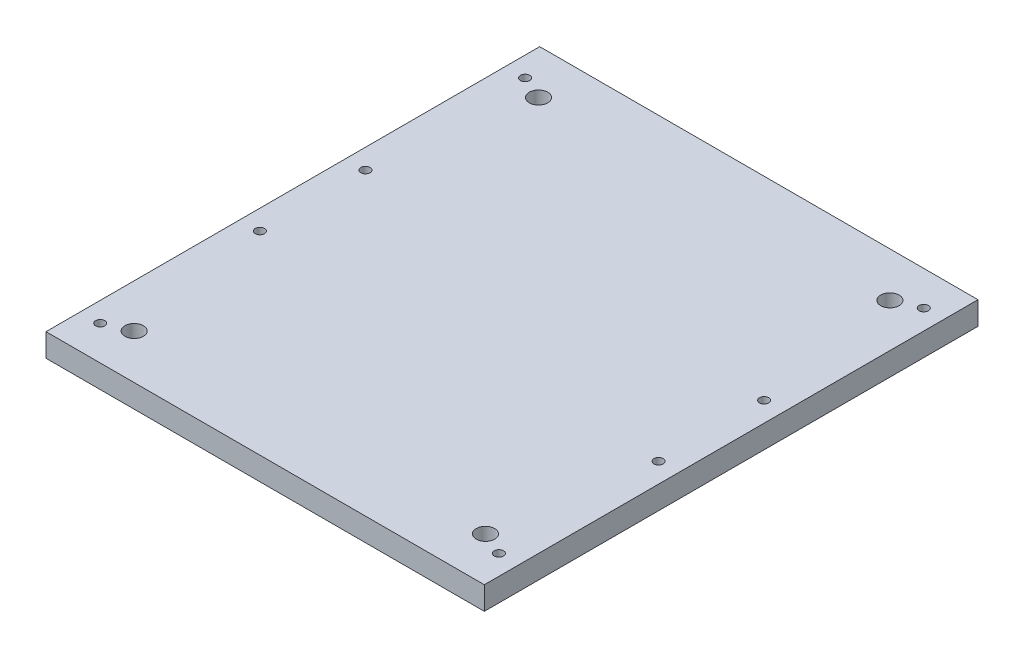
ISO-10303-21;
HEADER;
FILE_DESCRIPTION(('STEP AP214'),'2;1');
FILE_NAME('part.step','',(''),(''),'','','');
FILE_SCHEMA(('AUTOMOTIVE_DESIGN { 1 0 10303 214 1 1 1 1 }'));
ENDSEC;
DATA;
#1=APPLICATION_CONTEXT('core data for automotive mechanical design processes');
#2=APPLICATION_PROTOCOL_DEFINITION('international standard','automotive_design',2000,#1);
#3=PRODUCT_CONTEXT('',#1,'mechanical');
#4=PRODUCT('Part','Part','',(#3));
#5=PRODUCT_RELATED_PRODUCT_CATEGORY('part','',(#4));
#6=PRODUCT_DEFINITION_FORMATION('','',#4);
#7=PRODUCT_DEFINITION_CONTEXT('part definition',#1,'design');
#8=PRODUCT_DEFINITION('design','',#6,#7);
#9=PRODUCT_DEFINITION_SHAPE('','',#8);
#10=(LENGTH_UNIT() NAMED_UNIT(*) SI_UNIT(.MILLI.,.METRE.));
#11=(NAMED_UNIT(*) PLANE_ANGLE_UNIT() SI_UNIT($,.RADIAN.));
#12=(NAMED_UNIT(*) SI_UNIT($,.STERADIAN.) SOLID_ANGLE_UNIT());
#13=UNCERTAINTY_MEASURE_WITH_UNIT(LENGTH_MEASURE(1.E-05),#10,'distance_accuracy_value','');
#14=(GEOMETRIC_REPRESENTATION_CONTEXT(3) GLOBAL_UNCERTAINTY_ASSIGNED_CONTEXT((#13)) GLOBAL_UNIT_ASSIGNED_CONTEXT((#10,
#11,#12)) REPRESENTATION_CONTEXT('',''));
#15=CARTESIAN_POINT('',(0.,0.,0.));
#16=DIRECTION('',(0.,0.,1.));
#17=DIRECTION('',(1.,0.,0.));
#18=AXIS2_PLACEMENT_3D('',#15,#16,#17);
#19=CARTESIAN_POINT('',(0.,5.,53.5));
#20=DIRECTION('',(0.,0.,-1.));
#21=DIRECTION('',(-1.,0.,0.));
#22=AXIS2_PLACEMENT_3D('',#19,#20,#21);
#23=PLANE('',#22);
#24=DIRECTION('',(1.,0.,0.));
#25=VECTOR('',#24,1.);
#26=CARTESIAN_POINT('',(0.,0.,53.5));
#27=LINE('',#26,#25);
#28=CARTESIAN_POINT('',(-47.5,0.,53.5));
#29=VERTEX_POINT('',#28);
#30=CARTESIAN_POINT('',(47.5,0.,53.5));
#31=VERTEX_POINT('',#30);
#32=EDGE_CURVE('E115',#29,#31,#27,.T.);
#33=ORIENTED_EDGE('',*,*,#32,.T.);
#34=DIRECTION('',(0.,-1.,0.));
#35=VECTOR('',#34,1.);
#36=CARTESIAN_POINT('',(47.5,5.,53.5));
#37=LINE('',#36,#35);
#38=CARTESIAN_POINT('',(47.5,5.,53.5));
#39=VERTEX_POINT('',#38);
#40=EDGE_CURVE('E11',#39,#31,#37,.T.);
#41=ORIENTED_EDGE('',*,*,#40,.F.);
#42=DIRECTION('',(1.,0.,0.));
#43=VECTOR('',#42,1.);
#44=CARTESIAN_POINT('',(0.,5.,53.5));
#45=LINE('',#44,#43);
#46=CARTESIAN_POINT('',(-47.5,5.,53.5));
#47=VERTEX_POINT('',#46);
#48=EDGE_CURVE('E89',#47,#39,#45,.T.);
#49=ORIENTED_EDGE('',*,*,#48,.F.);
#50=DIRECTION('',(0.,-1.,0.));
#51=VECTOR('',#50,1.);
#52=CARTESIAN_POINT('',(-47.5,5.,53.5));
#53=LINE('',#52,#51);
#54=EDGE_CURVE('E55',#47,#29,#53,.T.);
#55=ORIENTED_EDGE('',*,*,#54,.T.);
#56=EDGE_LOOP('',(#33,#41,#49,#55));
#57=FACE_BOUND('',#56,.T.);
#58=ADVANCED_FACE('F39',(#57),#23,.F.);
#59=CARTESIAN_POINT('',(47.5,5.,0.));
#60=DIRECTION('',(-1.,0.,0.));
#61=DIRECTION('',(0.,0.,1.));
#62=AXIS2_PLACEMENT_3D('',#59,#60,#61);
#63=PLANE('',#62);
#64=DIRECTION('',(0.,0.,-1.));
#65=VECTOR('',#64,1.);
#66=CARTESIAN_POINT('',(47.5,0.,0.));
#67=LINE('',#66,#65);
#68=CARTESIAN_POINT('',(47.5,0.,-53.5));
#69=VERTEX_POINT('',#68);
#70=EDGE_CURVE('E94',#31,#69,#67,.T.);
#71=ORIENTED_EDGE('',*,*,#70,.T.);
#72=DIRECTION('',(0.,-1.,0.));
#73=VECTOR('',#72,1.);
#74=CARTESIAN_POINT('',(47.5,5.,-53.5));
#75=LINE('',#74,#73);
#76=CARTESIAN_POINT('',(47.5,5.,-53.5));
#77=VERTEX_POINT('',#76);
#78=EDGE_CURVE('E47',#77,#69,#75,.T.);
#79=ORIENTED_EDGE('',*,*,#78,.F.);
#80=DIRECTION('',(0.,0.,-1.));
#81=VECTOR('',#80,1.);
#82=CARTESIAN_POINT('',(47.5,5.,0.));
#83=LINE('',#82,#81);
#84=EDGE_CURVE('E80',#39,#77,#83,.T.);
#85=ORIENTED_EDGE('',*,*,#84,.F.);
#86=ORIENTED_EDGE('',*,*,#40,.T.);
#87=EDGE_LOOP('',(#71,#79,#85,#86));
#88=FACE_BOUND('',#87,.T.);
#89=ADVANCED_FACE('F93',(#88),#63,.F.);
#90=CARTESIAN_POINT('',(0.,5.,-53.5));
#91=DIRECTION('',(0.,0.,-1.));
#92=DIRECTION('',(-1.,0.,0.));
#93=AXIS2_PLACEMENT_3D('',#90,#91,#92);
#94=PLANE('',#93);
#95=DIRECTION('',(1.,0.,0.));
#96=VECTOR('',#95,1.);
#97=CARTESIAN_POINT('',(0.,0.,-53.5));
#98=LINE('',#97,#96);
#99=CARTESIAN_POINT('',(-47.5,0.,-53.5));
#100=VERTEX_POINT('',#99);
#101=EDGE_CURVE('E119',#100,#69,#98,.T.);
#102=ORIENTED_EDGE('',*,*,#101,.F.);
#103=DIRECTION('',(0.,-1.,0.));
#104=VECTOR('',#103,1.);
#105=CARTESIAN_POINT('',(-47.5,5.,-53.5));
#106=LINE('',#105,#104);
#107=CARTESIAN_POINT('',(-47.5,5.,-53.5));
#108=VERTEX_POINT('',#107);
#109=EDGE_CURVE('E69',#108,#100,#106,.T.);
#110=ORIENTED_EDGE('',*,*,#109,.F.);
#111=DIRECTION('',(1.,0.,0.));
#112=VECTOR('',#111,1.);
#113=CARTESIAN_POINT('',(0.,5.,-53.5));
#114=LINE('',#113,#112);
#115=EDGE_CURVE('E88',#108,#77,#114,.T.);
#116=ORIENTED_EDGE('',*,*,#115,.T.);
#117=ORIENTED_EDGE('',*,*,#78,.T.);
#118=EDGE_LOOP('',(#102,#110,#116,#117));
#119=FACE_BOUND('',#118,.T.);
#120=ADVANCED_FACE('F97',(#119),#94,.T.);
#121=CARTESIAN_POINT('',(38.075,5.,43.825));
#122=DIRECTION('',(0.,-1.,0.));
#123=DIRECTION('',(0.,0.,-1.));
#124=AXIS2_PLACEMENT_3D('',#121,#122,#123);
#125=CYLINDRICAL_SURFACE('',#124,2.);
#126=CARTESIAN_POINT('',(38.075,5.,43.825));
#127=DIRECTION('',(0.,1.,0.));
#128=DIRECTION('',(0.,0.,1.));
#129=AXIS2_PLACEMENT_3D('',#126,#127,#128);
#130=CIRCLE('',#129,2.);
#131=CARTESIAN_POINT('',(38.075,5.,45.825));
#132=VERTEX_POINT('',#131);
#133=EDGE_CURVE('E109',#132,#132,#130,.T.);
#134=ORIENTED_EDGE('',*,*,#133,.T.);
#135=EDGE_LOOP('',(#134));
#136=FACE_BOUND('',#135,.T.);
#137=CARTESIAN_POINT('',(38.075,0.,43.825));
#138=DIRECTION('',(0.,1.,0.));
#139=DIRECTION('',(0.,0.,1.));
#140=AXIS2_PLACEMENT_3D('',#137,#138,#139);
#141=CIRCLE('',#140,2.);
#142=CARTESIAN_POINT('',(38.075,0.,45.825));
#143=VERTEX_POINT('',#142);
#144=EDGE_CURVE('E130',#143,#143,#141,.T.);
#145=ORIENTED_EDGE('',*,*,#144,.F.);
#146=EDGE_LOOP('',(#145));
#147=FACE_BOUND('',#146,.T.);
#148=ADVANCED_FACE('F224',(#136,#147),#125,.F.);
#149=CARTESIAN_POINT('',(38.075,5.,-43.825));
#150=DIRECTION('',(0.,-1.,0.));
#151=DIRECTION('',(0.,0.,-1.));
#152=AXIS2_PLACEMENT_3D('',#149,#150,#151);
#153=CYLINDRICAL_SURFACE('',#152,2.);
#154=CARTESIAN_POINT('',(38.075,5.,-43.825));
#155=DIRECTION('',(0.,1.,0.));
#156=DIRECTION('',(0.,0.,1.));
#157=AXIS2_PLACEMENT_3D('',#154,#155,#156);
#158=CIRCLE('',#157,2.);
#159=CARTESIAN_POINT('',(38.075,5.,-41.825));
#160=VERTEX_POINT('',#159);
#161=EDGE_CURVE('E106',#160,#160,#158,.F.);
#162=ORIENTED_EDGE('',*,*,#161,.F.);
#163=EDGE_LOOP('',(#162));
#164=FACE_BOUND('',#163,.T.);
#165=CARTESIAN_POINT('',(38.075,0.,-43.825));
#166=DIRECTION('',(0.,1.,0.));
#167=DIRECTION('',(0.,0.,1.));
#168=AXIS2_PLACEMENT_3D('',#165,#166,#167);
#169=CIRCLE('',#168,2.);
#170=CARTESIAN_POINT('',(38.075,0.,-41.825));
#171=VERTEX_POINT('',#170);
#172=EDGE_CURVE('E127',#171,#171,#169,.F.);
#173=ORIENTED_EDGE('',*,*,#172,.T.);
#174=EDGE_LOOP('',(#173));
#175=FACE_BOUND('',#174,.T.);
#176=ADVANCED_FACE('F226',(#164,#175),#153,.F.);
#177=CARTESIAN_POINT('',(-38.075,5.,-43.825));
#178=DIRECTION('',(0.,-1.,0.));
#179=DIRECTION('',(0.,0.,-1.));
#180=AXIS2_PLACEMENT_3D('',#177,#178,#179);
#181=CYLINDRICAL_SURFACE('',#180,2.);
#182=CARTESIAN_POINT('',(-38.075,5.,-43.825));
#183=DIRECTION('',(0.,1.,0.));
#184=DIRECTION('',(0.,0.,1.));
#185=AXIS2_PLACEMENT_3D('',#182,#183,#184);
#186=CIRCLE('',#185,2.);
#187=CARTESIAN_POINT('',(-38.075,5.,-41.825));
#188=VERTEX_POINT('',#187);
#189=EDGE_CURVE('E100',#188,#188,#186,.T.);
#190=ORIENTED_EDGE('',*,*,#189,.T.);
#191=EDGE_LOOP('',(#190));
#192=FACE_BOUND('',#191,.T.);
#193=CARTESIAN_POINT('',(-38.075,0.,-43.825));
#194=DIRECTION('',(0.,1.,0.));
#195=DIRECTION('',(0.,0.,1.));
#196=AXIS2_PLACEMENT_3D('',#193,#194,#195);
#197=CIRCLE('',#196,2.);
#198=CARTESIAN_POINT('',(-38.075,0.,-41.825));
#199=VERTEX_POINT('',#198);
#200=EDGE_CURVE('E124',#199,#199,#197,.T.);
#201=ORIENTED_EDGE('',*,*,#200,.F.);
#202=EDGE_LOOP('',(#201));
#203=FACE_BOUND('',#202,.T.);
#204=ADVANCED_FACE('F233',(#192,#203),#181,.F.);
#205=CARTESIAN_POINT('',(-47.5,5.,0.));
#206=DIRECTION('',(-1.,0.,0.));
#207=DIRECTION('',(0.,0.,1.));
#208=AXIS2_PLACEMENT_3D('',#205,#206,#207);
#209=PLANE('',#208);
#210=DIRECTION('',(0.,0.,-1.));
#211=VECTOR('',#210,1.);
#212=CARTESIAN_POINT('',(-47.5,0.,0.));
#213=LINE('',#212,#211);
#214=EDGE_CURVE('E121',#29,#100,#213,.T.);
#215=ORIENTED_EDGE('',*,*,#214,.F.);
#216=ORIENTED_EDGE('',*,*,#54,.F.);
#217=DIRECTION('',(0.,0.,-1.));
#218=VECTOR('',#217,1.);
#219=CARTESIAN_POINT('',(-47.5,5.,0.));
#220=LINE('',#219,#218);
#221=EDGE_CURVE('E98',#47,#108,#220,.T.);
#222=ORIENTED_EDGE('',*,*,#221,.T.);
#223=ORIENTED_EDGE('',*,*,#109,.T.);
#224=EDGE_LOOP('',(#215,#216,#222,#223));
#225=FACE_BOUND('',#224,.T.);
#226=ADVANCED_FACE('F242',(#225),#209,.T.);
#227=CARTESIAN_POINT('',(-38.075,5.,43.825));
#228=DIRECTION('',(0.,-1.,0.));
#229=DIRECTION('',(0.,0.,-1.));
#230=AXIS2_PLACEMENT_3D('',#227,#228,#229);
#231=CYLINDRICAL_SURFACE('',#230,2.);
#232=CARTESIAN_POINT('',(-38.075,5.,43.825));
#233=DIRECTION('',(0.,1.,0.));
#234=DIRECTION('',(0.,0.,1.));
#235=AXIS2_PLACEMENT_3D('',#232,#233,#234);
#236=CIRCLE('',#235,2.);
#237=CARTESIAN_POINT('',(-38.075,5.,45.825));
#238=VERTEX_POINT('',#237);
#239=EDGE_CURVE('E112',#238,#238,#236,.F.);
#240=ORIENTED_EDGE('',*,*,#239,.F.);
#241=EDGE_LOOP('',(#240));
#242=FACE_BOUND('',#241,.T.);
#243=CARTESIAN_POINT('',(-38.075,0.,43.825));
#244=DIRECTION('',(0.,1.,0.));
#245=DIRECTION('',(0.,0.,1.));
#246=AXIS2_PLACEMENT_3D('',#243,#244,#245);
#247=CIRCLE('',#246,2.);
#248=CARTESIAN_POINT('',(-38.075,0.,45.825));
#249=VERTEX_POINT('',#248);
#250=EDGE_CURVE('E133',#249,#249,#247,.F.);
#251=ORIENTED_EDGE('',*,*,#250,.T.);
#252=EDGE_LOOP('',(#251));
#253=FACE_BOUND('',#252,.T.);
#254=ADVANCED_FACE('F244',(#242,#253),#231,.F.);
#255=CARTESIAN_POINT('',(0.,5.,0.));
#256=DIRECTION('',(0.,1.,0.));
#257=DIRECTION('',(0.,0.,1.));
#258=AXIS2_PLACEMENT_3D('',#255,#256,#257);
#259=PLANE('',#258);
#260=CARTESIAN_POINT('',(-43.205,5.,11.4372225515875));
#261=DIRECTION('',(0.,-1.,0.));
#262=DIRECTION('',(0.,0.,1.));
#263=AXIS2_PLACEMENT_3D('',#260,#261,#262);
#264=CIRCLE('',#263,0.999999999999998);
#265=CARTESIAN_POINT('',(-43.205,5.,12.4372225515875));
#266=VERTEX_POINT('',#265);
#267=EDGE_CURVE('E181',#266,#266,#264,.T.);
#268=ORIENTED_EDGE('',*,*,#267,.T.);
#269=EDGE_LOOP('',(#268));
#270=FACE_BOUND('',#269,.T.);
#271=CARTESIAN_POINT('',(-43.205,5.,-11.4372225515875));
#272=DIRECTION('',(0.,1.,0.));
#273=DIRECTION('',(0.,0.,-1.));
#274=AXIS2_PLACEMENT_3D('',#271,#272,#273);
#275=CIRCLE('',#274,0.999999999999998);
#276=CARTESIAN_POINT('',(-43.205,5.,-12.4372225515875));
#277=VERTEX_POINT('',#276);
#278=EDGE_CURVE('E178',#277,#277,#275,.T.);
#279=ORIENTED_EDGE('',*,*,#278,.F.);
#280=EDGE_LOOP('',(#279));
#281=FACE_BOUND('',#280,.T.);
#282=CARTESIAN_POINT('',(43.205,5.,11.4372225515875));
#283=DIRECTION('',(0.,1.,0.));
#284=DIRECTION('',(0.,0.,1.));
#285=AXIS2_PLACEMENT_3D('',#282,#283,#284);
#286=CIRCLE('',#285,0.999999999999998);
#287=CARTESIAN_POINT('',(43.205,5.,12.4372225515875));
#288=VERTEX_POINT('',#287);
#289=EDGE_CURVE('E172',#288,#288,#286,.T.);
#290=ORIENTED_EDGE('',*,*,#289,.F.);
#291=EDGE_LOOP('',(#290));
#292=FACE_BOUND('',#291,.T.);
#293=CARTESIAN_POINT('',(-43.205,5.,46.04));
#294=DIRECTION('',(0.,1.,0.));
#295=DIRECTION('',(0.,0.,-1.));
#296=AXIS2_PLACEMENT_3D('',#293,#294,#295);
#297=CIRCLE('',#296,0.999999999999998);
#298=CARTESIAN_POINT('',(-43.205,5.,45.04));
#299=VERTEX_POINT('',#298);
#300=EDGE_CURVE('E166',#299,#299,#297,.T.);
#301=ORIENTED_EDGE('',*,*,#300,.F.);
#302=EDGE_LOOP('',(#301));
#303=FACE_BOUND('',#302,.T.);
#304=CARTESIAN_POINT('',(-43.205,5.,-46.04));
#305=DIRECTION('',(0.,-1.,0.));
#306=DIRECTION('',(0.,0.,1.));
#307=AXIS2_PLACEMENT_3D('',#304,#305,#306);
#308=CIRCLE('',#307,0.999999999999998);
#309=CARTESIAN_POINT('',(-43.205,5.,-45.04));
#310=VERTEX_POINT('',#309);
#311=EDGE_CURVE('E155',#310,#310,#308,.T.);
#312=ORIENTED_EDGE('',*,*,#311,.T.);
#313=EDGE_LOOP('',(#312));
#314=FACE_BOUND('',#313,.T.);
#315=CARTESIAN_POINT('',(43.205,5.,46.04));
#316=DIRECTION('',(0.,-1.,0.));
#317=DIRECTION('',(0.,0.,-1.));
#318=AXIS2_PLACEMENT_3D('',#315,#316,#317);
#319=CIRCLE('',#318,0.999999999999998);
#320=CARTESIAN_POINT('',(43.205,5.,45.04));
#321=VERTEX_POINT('',#320);
#322=EDGE_CURVE('E149',#321,#321,#319,.T.);
#323=ORIENTED_EDGE('',*,*,#322,.T.);
#324=EDGE_LOOP('',(#323));
#325=FACE_BOUND('',#324,.T.);
#326=CARTESIAN_POINT('',(43.205,5.,-11.4372225515875));
#327=DIRECTION('',(0.,-1.,0.));
#328=DIRECTION('',(0.,0.,-1.));
#329=AXIS2_PLACEMENT_3D('',#326,#327,#328);
#330=CIRCLE('',#329,0.999999999999998);
#331=CARTESIAN_POINT('',(43.205,5.,-12.4372225515875));
#332=VERTEX_POINT('',#331);
#333=EDGE_CURVE('E145',#332,#332,#330,.T.);
#334=ORIENTED_EDGE('',*,*,#333,.T.);
#335=EDGE_LOOP('',(#334));
#336=FACE_BOUND('',#335,.T.);
#337=CARTESIAN_POINT('',(43.205,5.,-46.04));
#338=DIRECTION('',(0.,1.,0.));
#339=DIRECTION('',(0.,0.,1.));
#340=AXIS2_PLACEMENT_3D('',#337,#338,#339);
#341=CIRCLE('',#340,0.999999999999998);
#342=CARTESIAN_POINT('',(43.205,5.,-45.04));
#343=VERTEX_POINT('',#342);
#344=EDGE_CURVE('E142',#343,#343,#341,.T.);
#345=ORIENTED_EDGE('',*,*,#344,.F.);
#346=EDGE_LOOP('',(#345));
#347=FACE_BOUND('',#346,.T.);
#348=ORIENTED_EDGE('',*,*,#48,.T.);
#349=ORIENTED_EDGE('',*,*,#84,.T.);
#350=ORIENTED_EDGE('',*,*,#115,.F.);
#351=ORIENTED_EDGE('',*,*,#221,.F.);
#352=EDGE_LOOP('',(#348,#349,#350,#351));
#353=FACE_BOUND('',#352,.T.);
#354=ORIENTED_EDGE('',*,*,#189,.F.);
#355=EDGE_LOOP('',(#354));
#356=FACE_BOUND('',#355,.T.);
#357=ORIENTED_EDGE('',*,*,#161,.T.);
#358=EDGE_LOOP('',(#357));
#359=FACE_BOUND('',#358,.T.);
#360=ORIENTED_EDGE('',*,*,#133,.F.);
#361=EDGE_LOOP('',(#360));
#362=FACE_BOUND('',#361,.T.);
#363=ORIENTED_EDGE('',*,*,#239,.T.);
#364=EDGE_LOOP('',(#363));
#365=FACE_BOUND('',#364,.T.);
#366=ADVANCED_FACE('F84',(#270,#281,#292,#303,#314,#325,#336,#347,#353,#356,#359,#362,#365),
#259,.T.);
#367=CARTESIAN_POINT('',(0.,0.,0.));
#368=DIRECTION('',(0.,1.,0.));
#369=DIRECTION('',(0.,0.,1.));
#370=AXIS2_PLACEMENT_3D('',#367,#368,#369);
#371=PLANE('',#370);
#372=CARTESIAN_POINT('',(-43.205,0.,11.4372225515875));
#373=DIRECTION('',(0.,1.,0.));
#374=DIRECTION('',(0.,0.,1.));
#375=AXIS2_PLACEMENT_3D('',#372,#373,#374);
#376=CIRCLE('',#375,0.999999999999998);
#377=CARTESIAN_POINT('',(-43.205,0.,12.4372225515875));
#378=VERTEX_POINT('',#377);
#379=EDGE_CURVE('E182',#378,#378,#376,.T.);
#380=ORIENTED_EDGE('',*,*,#379,.T.);
#381=EDGE_LOOP('',(#380));
#382=FACE_BOUND('',#381,.T.);
#383=CARTESIAN_POINT('',(-43.205,0.,-11.4372225515875));
#384=DIRECTION('',(0.,1.,0.));
#385=DIRECTION('',(0.,0.,1.));
#386=AXIS2_PLACEMENT_3D('',#383,#384,#385);
#387=CIRCLE('',#386,0.999999999999998);
#388=CARTESIAN_POINT('',(-43.205,0.,-10.4372225515875));
#389=VERTEX_POINT('',#388);
#390=EDGE_CURVE('E175',#389,#389,#387,.F.);
#391=ORIENTED_EDGE('',*,*,#390,.F.);
#392=EDGE_LOOP('',(#391));
#393=FACE_BOUND('',#392,.T.);
#394=CARTESIAN_POINT('',(43.205,0.,11.4372225515875));
#395=DIRECTION('',(0.,1.,0.));
#396=DIRECTION('',(0.,0.,1.));
#397=AXIS2_PLACEMENT_3D('',#394,#395,#396);
#398=CIRCLE('',#397,0.999999999999998);
#399=CARTESIAN_POINT('',(43.205,0.,12.4372225515875));
#400=VERTEX_POINT('',#399);
#401=EDGE_CURVE('E169',#400,#400,#398,.F.);
#402=ORIENTED_EDGE('',*,*,#401,.F.);
#403=EDGE_LOOP('',(#402));
#404=FACE_BOUND('',#403,.T.);
#405=CARTESIAN_POINT('',(-43.205,0.,46.04));
#406=DIRECTION('',(0.,1.,0.));
#407=DIRECTION('',(0.,0.,1.));
#408=AXIS2_PLACEMENT_3D('',#405,#406,#407);
#409=CIRCLE('',#408,0.999999999999998);
#410=CARTESIAN_POINT('',(-43.205,0.,47.04));
#411=VERTEX_POINT('',#410);
#412=EDGE_CURVE('E161',#411,#411,#409,.F.);
#413=ORIENTED_EDGE('',*,*,#412,.F.);
#414=EDGE_LOOP('',(#413));
#415=FACE_BOUND('',#414,.T.);
#416=CARTESIAN_POINT('',(-43.205,0.,-46.04));
#417=DIRECTION('',(0.,1.,0.));
#418=DIRECTION('',(0.,0.,1.));
#419=AXIS2_PLACEMENT_3D('',#416,#417,#418);
#420=CIRCLE('',#419,0.999999999999998);
#421=CARTESIAN_POINT('',(-43.205,0.,-45.04));
#422=VERTEX_POINT('',#421);
#423=EDGE_CURVE('E158',#422,#422,#420,.T.);
#424=ORIENTED_EDGE('',*,*,#423,.T.);
#425=EDGE_LOOP('',(#424));
#426=FACE_BOUND('',#425,.T.);
#427=CARTESIAN_POINT('',(43.205,0.,46.04));
#428=DIRECTION('',(0.,1.,0.));
#429=DIRECTION('',(0.,0.,1.));
#430=AXIS2_PLACEMENT_3D('',#427,#428,#429);
#431=CIRCLE('',#430,0.999999999999998);
#432=CARTESIAN_POINT('',(43.205,0.,47.04));
#433=VERTEX_POINT('',#432);
#434=EDGE_CURVE('E152',#433,#433,#431,.T.);
#435=ORIENTED_EDGE('',*,*,#434,.T.);
#436=EDGE_LOOP('',(#435));
#437=FACE_BOUND('',#436,.T.);
#438=CARTESIAN_POINT('',(43.205,0.,-11.4372225515875));
#439=DIRECTION('',(0.,1.,0.));
#440=DIRECTION('',(0.,0.,1.));
#441=AXIS2_PLACEMENT_3D('',#438,#439,#440);
#442=CIRCLE('',#441,0.999999999999998);
#443=CARTESIAN_POINT('',(43.205,0.,-10.4372225515875));
#444=VERTEX_POINT('',#443);
#445=EDGE_CURVE('E146',#444,#444,#442,.T.);
#446=ORIENTED_EDGE('',*,*,#445,.T.);
#447=EDGE_LOOP('',(#446));
#448=FACE_BOUND('',#447,.T.);
#449=CARTESIAN_POINT('',(43.205,0.,-46.04));
#450=DIRECTION('',(0.,1.,0.));
#451=DIRECTION('',(0.,0.,1.));
#452=AXIS2_PLACEMENT_3D('',#449,#450,#451);
#453=CIRCLE('',#452,0.999999999999998);
#454=CARTESIAN_POINT('',(43.205,0.,-45.04));
#455=VERTEX_POINT('',#454);
#456=EDGE_CURVE('E117',#455,#455,#453,.F.);
#457=ORIENTED_EDGE('',*,*,#456,.F.);
#458=EDGE_LOOP('',(#457));
#459=FACE_BOUND('',#458,.T.);
#460=ORIENTED_EDGE('',*,*,#32,.F.);
#461=ORIENTED_EDGE('',*,*,#214,.T.);
#462=ORIENTED_EDGE('',*,*,#101,.T.);
#463=ORIENTED_EDGE('',*,*,#70,.F.);
#464=EDGE_LOOP('',(#460,#461,#462,#463));
#465=FACE_BOUND('',#464,.T.);
#466=ORIENTED_EDGE('',*,*,#200,.T.);
#467=EDGE_LOOP('',(#466));
#468=FACE_BOUND('',#467,.T.);
#469=ORIENTED_EDGE('',*,*,#172,.F.);
#470=EDGE_LOOP('',(#469));
#471=FACE_BOUND('',#470,.T.);
#472=ORIENTED_EDGE('',*,*,#144,.T.);
#473=EDGE_LOOP('',(#472));
#474=FACE_BOUND('',#473,.T.);
#475=ORIENTED_EDGE('',*,*,#250,.F.);
#476=EDGE_LOOP('',(#475));
#477=FACE_BOUND('',#476,.T.);
#478=ADVANCED_FACE('F197',(#382,#393,#404,#415,#426,#437,#448,#459,#465,#468,#471,#474,#477),
#371,.F.);
#479=CARTESIAN_POINT('',(43.205,-0.00100000000000013,-46.04));
#480=DIRECTION('',(0.,1.,0.));
#481=DIRECTION('',(0.,0.,1.));
#482=AXIS2_PLACEMENT_3D('',#479,#480,#481);
#483=CYLINDRICAL_SURFACE('',#482,0.999999999999998);
#484=ORIENTED_EDGE('',*,*,#344,.T.);
#485=EDGE_LOOP('',(#484));
#486=FACE_BOUND('',#485,.T.);
#487=ORIENTED_EDGE('',*,*,#456,.T.);
#488=EDGE_LOOP('',(#487));
#489=FACE_BOUND('',#488,.T.);
#490=ADVANCED_FACE('F200',(#486,#489),#483,.F.);
#491=CARTESIAN_POINT('',(43.205,-0.00100000000000013,-11.4372225515875));
#492=DIRECTION('',(0.,1.,0.));
#493=DIRECTION('',(0.,0.,1.));
#494=AXIS2_PLACEMENT_3D('',#491,#492,#493);
#495=CYLINDRICAL_SURFACE('',#494,0.999999999999998);
#496=ORIENTED_EDGE('',*,*,#333,.F.);
#497=EDGE_LOOP('',(#496));
#498=FACE_BOUND('',#497,.T.);
#499=ORIENTED_EDGE('',*,*,#445,.F.);
#500=EDGE_LOOP('',(#499));
#501=FACE_BOUND('',#500,.T.);
#502=ADVANCED_FACE('F271',(#498,#501),#495,.F.);
#503=CARTESIAN_POINT('',(43.205,-0.00100000000000013,46.04));
#504=DIRECTION('',(0.,1.,0.));
#505=DIRECTION('',(0.,0.,1.));
#506=AXIS2_PLACEMENT_3D('',#503,#504,#505);
#507=CYLINDRICAL_SURFACE('',#506,0.999999999999998);
#508=ORIENTED_EDGE('',*,*,#322,.F.);
#509=EDGE_LOOP('',(#508));
#510=FACE_BOUND('',#509,.T.);
#511=ORIENTED_EDGE('',*,*,#434,.F.);
#512=EDGE_LOOP('',(#511));
#513=FACE_BOUND('',#512,.T.);
#514=ADVANCED_FACE('F275',(#510,#513),#507,.F.);
#515=CARTESIAN_POINT('',(-43.205,-0.00100000000000013,-46.04));
#516=DIRECTION('',(0.,1.,0.));
#517=DIRECTION('',(0.,0.,1.));
#518=AXIS2_PLACEMENT_3D('',#515,#516,#517);
#519=CYLINDRICAL_SURFACE('',#518,0.999999999999998);
#520=ORIENTED_EDGE('',*,*,#311,.F.);
#521=EDGE_LOOP('',(#520));
#522=FACE_BOUND('',#521,.T.);
#523=ORIENTED_EDGE('',*,*,#423,.F.);
#524=EDGE_LOOP('',(#523));
#525=FACE_BOUND('',#524,.T.);
#526=ADVANCED_FACE('F279',(#522,#525),#519,.F.);
#527=CARTESIAN_POINT('',(-43.205,-0.00100000000000013,46.04));
#528=DIRECTION('',(0.,1.,0.));
#529=DIRECTION('',(0.,0.,1.));
#530=AXIS2_PLACEMENT_3D('',#527,#528,#529);
#531=CYLINDRICAL_SURFACE('',#530,0.999999999999998);
#532=ORIENTED_EDGE('',*,*,#300,.T.);
#533=EDGE_LOOP('',(#532));
#534=FACE_BOUND('',#533,.T.);
#535=ORIENTED_EDGE('',*,*,#412,.T.);
#536=EDGE_LOOP('',(#535));
#537=FACE_BOUND('',#536,.T.);
#538=ADVANCED_FACE('F283',(#534,#537),#531,.F.);
#539=CARTESIAN_POINT('',(43.205,-0.00100000000000013,11.4372225515875));
#540=DIRECTION('',(0.,1.,0.));
#541=DIRECTION('',(0.,0.,1.));
#542=AXIS2_PLACEMENT_3D('',#539,#540,#541);
#543=CYLINDRICAL_SURFACE('',#542,0.999999999999998);
#544=ORIENTED_EDGE('',*,*,#289,.T.);
#545=EDGE_LOOP('',(#544));
#546=FACE_BOUND('',#545,.T.);
#547=ORIENTED_EDGE('',*,*,#401,.T.);
#548=EDGE_LOOP('',(#547));
#549=FACE_BOUND('',#548,.T.);
#550=ADVANCED_FACE('F287',(#546,#549),#543,.F.);
#551=CARTESIAN_POINT('',(-43.205,-0.00100000000000013,-11.4372225515875));
#552=DIRECTION('',(0.,1.,0.));
#553=DIRECTION('',(0.,0.,1.));
#554=AXIS2_PLACEMENT_3D('',#551,#552,#553);
#555=CYLINDRICAL_SURFACE('',#554,0.999999999999998);
#556=ORIENTED_EDGE('',*,*,#278,.T.);
#557=EDGE_LOOP('',(#556));
#558=FACE_BOUND('',#557,.T.);
#559=ORIENTED_EDGE('',*,*,#390,.T.);
#560=EDGE_LOOP('',(#559));
#561=FACE_BOUND('',#560,.T.);
#562=ADVANCED_FACE('F193',(#558,#561),#555,.F.);
#563=CARTESIAN_POINT('',(-43.205,-0.00100000000000013,11.4372225515875));
#564=DIRECTION('',(0.,1.,0.));
#565=DIRECTION('',(0.,0.,1.));
#566=AXIS2_PLACEMENT_3D('',#563,#564,#565);
#567=CYLINDRICAL_SURFACE('',#566,0.999999999999998);
#568=ORIENTED_EDGE('',*,*,#267,.F.);
#569=EDGE_LOOP('',(#568));
#570=FACE_BOUND('',#569,.T.);
#571=ORIENTED_EDGE('',*,*,#379,.F.);
#572=EDGE_LOOP('',(#571));
#573=FACE_BOUND('',#572,.T.);
#574=ADVANCED_FACE('F190',(#570,#573),#567,.F.);
#575=CLOSED_SHELL('',(#58,#89,#120,#148,#176,#204,#226,#254,#366,#478,#490,#502,#514,#526,#538,
#550,#562,#574));
#576=MANIFOLD_SOLID_BREP('B2',#575);
#577=ADVANCED_BREP_SHAPE_REPRESENTATION('',(#18,#576),#14);
#578=SHAPE_DEFINITION_REPRESENTATION(#9,#577);
ENDSEC;
END-ISO-10303-21;
